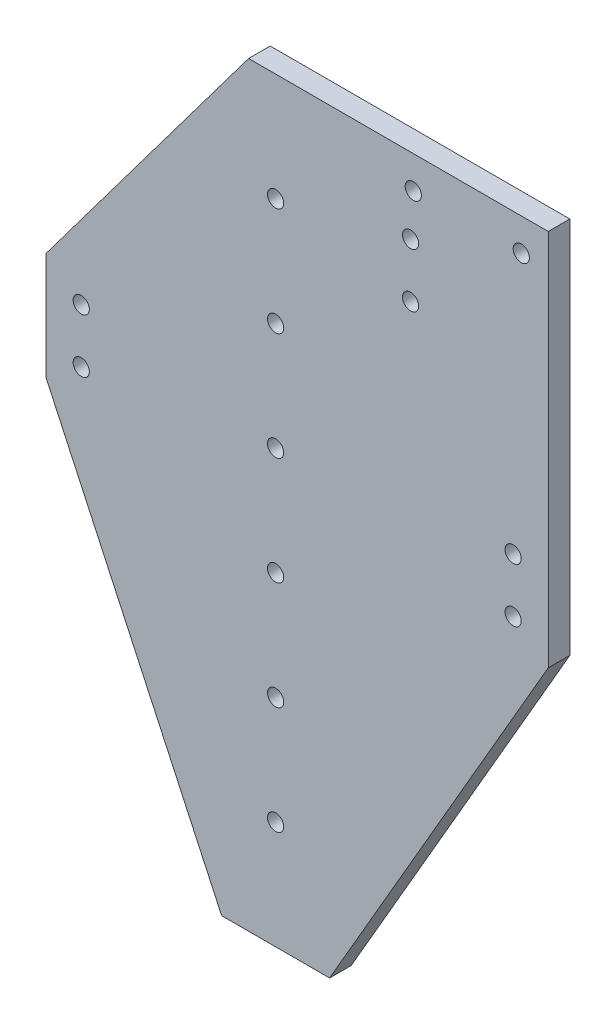
ISO-10303-21;
HEADER;
FILE_DESCRIPTION(('STEP AP214'),'2;1');
FILE_NAME('part.step','',(''),(''),'','','');
FILE_SCHEMA(('AUTOMOTIVE_DESIGN { 1 0 10303 214 1 1 1 1 }'));
ENDSEC;
DATA;
#1=APPLICATION_CONTEXT('core data for automotive mechanical design processes');
#2=APPLICATION_PROTOCOL_DEFINITION('international standard','automotive_design',2000,#1);
#3=PRODUCT_CONTEXT('',#1,'mechanical');
#4=PRODUCT('Part','Part','',(#3));
#5=PRODUCT_RELATED_PRODUCT_CATEGORY('part','',(#4));
#6=PRODUCT_DEFINITION_FORMATION('','',#4);
#7=PRODUCT_DEFINITION_CONTEXT('part definition',#1,'design');
#8=PRODUCT_DEFINITION('design','',#6,#7);
#9=PRODUCT_DEFINITION_SHAPE('','',#8);
#10=(LENGTH_UNIT() NAMED_UNIT(*) SI_UNIT(.MILLI.,.METRE.));
#11=(NAMED_UNIT(*) PLANE_ANGLE_UNIT() SI_UNIT($,.RADIAN.));
#12=(NAMED_UNIT(*) SI_UNIT($,.STERADIAN.) SOLID_ANGLE_UNIT());
#13=UNCERTAINTY_MEASURE_WITH_UNIT(LENGTH_MEASURE(1.E-05),#10,'distance_accuracy_value','');
#14=(GEOMETRIC_REPRESENTATION_CONTEXT(3) GLOBAL_UNCERTAINTY_ASSIGNED_CONTEXT((#13)) GLOBAL_UNIT_ASSIGNED_CONTEXT((#10,
#11,#12)) REPRESENTATION_CONTEXT('',''));
#15=CARTESIAN_POINT('',(0.,0.,0.));
#16=DIRECTION('',(0.,0.,1.));
#17=DIRECTION('',(1.,0.,0.));
#18=AXIS2_PLACEMENT_3D('',#15,#16,#17);
#19=CARTESIAN_POINT('',(0.,0.,4.));
#20=DIRECTION('',(0.,0.,-1.));
#21=DIRECTION('',(-1.,0.,0.));
#22=AXIS2_PLACEMENT_3D('',#19,#20,#21);
#23=PLANE('',#22);
#24=DIRECTION('',(0.50079253728353,0.865567348391287,0.));
#25=VECTOR('',#24,1.);
#26=CARTESIAN_POINT('',(-40.5,-70.,4.));
#27=LINE('',#26,#25);
#28=CARTESIAN_POINT('',(-40.5,-70.,4.));
#29=VERTEX_POINT('',#28);
#30=CARTESIAN_POINT('',(0.,0.,4.));
#31=VERTEX_POINT('',#30);
#32=EDGE_CURVE('E143',#29,#31,#27,.T.);
#33=ORIENTED_EDGE('',*,*,#32,.T.);
#34=DIRECTION('',(0.,1.,0.));
#35=VECTOR('',#34,1.);
#36=CARTESIAN_POINT('',(0.,0.,4.));
#37=LINE('',#36,#35);
#38=CARTESIAN_POINT('',(0.,70.,4.));
#39=VERTEX_POINT('',#38);
#40=EDGE_CURVE('E96',#31,#39,#37,.T.);
#41=ORIENTED_EDGE('',*,*,#40,.T.);
#42=DIRECTION('',(-1.,0.,0.));
#43=VECTOR('',#42,1.);
#44=CARTESIAN_POINT('',(-55.5,70.,4.));
#45=LINE('',#44,#43);
#46=CARTESIAN_POINT('',(-55.5,70.,4.));
#47=VERTEX_POINT('',#46);
#48=EDGE_CURVE('E159',#39,#47,#45,.T.);
#49=ORIENTED_EDGE('',*,*,#48,.T.);
#50=DIRECTION('',(-0.6,-0.8,0.));
#51=VECTOR('',#50,1.);
#52=CARTESIAN_POINT('',(-93.,20.,4.));
#53=LINE('',#52,#51);
#54=CARTESIAN_POINT('',(-93.,20.,4.));
#55=VERTEX_POINT('',#54);
#56=EDGE_CURVE('E112',#47,#55,#53,.T.);
#57=ORIENTED_EDGE('',*,*,#56,.T.);
#58=DIRECTION('',(0.,-1.,0.));
#59=VECTOR('',#58,1.);
#60=CARTESIAN_POINT('',(-93.,0.,4.));
#61=LINE('',#60,#59);
#62=CARTESIAN_POINT('',(-93.,0.,4.));
#63=VERTEX_POINT('',#62);
#64=EDGE_CURVE('E108',#55,#63,#61,.T.);
#65=ORIENTED_EDGE('',*,*,#64,.T.);
#66=DIRECTION('',(0.421111306454629,-0.907008967748432,0.));
#67=VECTOR('',#66,1.);
#68=CARTESIAN_POINT('',(-93.,0.,4.));
#69=LINE('',#68,#67);
#70=CARTESIAN_POINT('',(-60.5,-70.,4.));
#71=VERTEX_POINT('',#70);
#72=EDGE_CURVE('E115',#63,#71,#69,.T.);
#73=ORIENTED_EDGE('',*,*,#72,.T.);
#74=DIRECTION('',(1.,0.,0.));
#75=VECTOR('',#74,1.);
#76=CARTESIAN_POINT('',(-60.5,-70.,4.));
#77=LINE('',#76,#75);
#78=EDGE_CURVE('E59',#71,#29,#77,.T.);
#79=ORIENTED_EDGE('',*,*,#78,.T.);
#80=EDGE_LOOP('',(#33,#41,#49,#57,#65,#73,#79));
#81=FACE_BOUND('',#80,.T.);
#82=CARTESIAN_POINT('',(-86.5,15.,4.));
#83=DIRECTION('',(0.,0.,1.));
#84=DIRECTION('',(1.,0.,0.));
#85=AXIS2_PLACEMENT_3D('',#82,#83,#84);
#86=CIRCLE('',#85,1.5);
#87=CARTESIAN_POINT('',(-85.,15.,4.));
#88=VERTEX_POINT('',#87);
#89=EDGE_CURVE('E137',#88,#88,#86,.T.);
#90=ORIENTED_EDGE('',*,*,#89,.F.);
#91=EDGE_LOOP('',(#90));
#92=FACE_BOUND('',#91,.T.);
#93=CARTESIAN_POINT('',(-86.5,5.00000000000003,4.));
#94=DIRECTION('',(0.,0.,1.));
#95=DIRECTION('',(-1.,0.,0.));
#96=AXIS2_PLACEMENT_3D('',#93,#94,#95);
#97=CIRCLE('',#96,1.5);
#98=CARTESIAN_POINT('',(-88.,5.00000000000003,4.));
#99=VERTEX_POINT('',#98);
#100=EDGE_CURVE('E175',#99,#99,#97,.T.);
#101=ORIENTED_EDGE('',*,*,#100,.F.);
#102=EDGE_LOOP('',(#101));
#103=FACE_BOUND('',#102,.T.);
#104=CARTESIAN_POINT('',(-6.50000000000001,5.00000000000003,4.));
#105=DIRECTION('',(0.,0.,1.));
#106=DIRECTION('',(1.,0.,0.));
#107=AXIS2_PLACEMENT_3D('',#104,#105,#106);
#108=CIRCLE('',#107,1.5);
#109=CARTESIAN_POINT('',(-5.,5.00000000000003,4.));
#110=VERTEX_POINT('',#109);
#111=EDGE_CURVE('E178',#110,#110,#108,.T.);
#112=ORIENTED_EDGE('',*,*,#111,.F.);
#113=EDGE_LOOP('',(#112));
#114=FACE_BOUND('',#113,.T.);
#115=CARTESIAN_POINT('',(-6.50000000000001,15.,4.));
#116=DIRECTION('',(0.,0.,1.));
#117=DIRECTION('',(-1.,0.,0.));
#118=AXIS2_PLACEMENT_3D('',#115,#116,#117);
#119=CIRCLE('',#118,1.5);
#120=CARTESIAN_POINT('',(-8.00000000000001,15.,4.));
#121=VERTEX_POINT('',#120);
#122=EDGE_CURVE('E183',#121,#121,#119,.T.);
#123=ORIENTED_EDGE('',*,*,#122,.F.);
#124=EDGE_LOOP('',(#123));
#125=FACE_BOUND('',#124,.T.);
#126=CARTESIAN_POINT('',(-25.5,56.,4.));
#127=DIRECTION('',(0.,0.,1.));
#128=DIRECTION('',(1.,0.,0.));
#129=AXIS2_PLACEMENT_3D('',#126,#127,#128);
#130=CIRCLE('',#129,1.5);
#131=CARTESIAN_POINT('',(-24.,56.,4.));
#132=VERTEX_POINT('',#131);
#133=EDGE_CURVE('E188',#132,#132,#130,.T.);
#134=ORIENTED_EDGE('',*,*,#133,.F.);
#135=EDGE_LOOP('',(#134));
#136=FACE_BOUND('',#135,.T.);
#137=CARTESIAN_POINT('',(-25.4999999999999,46.,4.));
#138=DIRECTION('',(0.,0.,1.));
#139=DIRECTION('',(1.,0.,0.));
#140=AXIS2_PLACEMENT_3D('',#137,#138,#139);
#141=CIRCLE('',#140,1.5);
#142=CARTESIAN_POINT('',(-23.9999999999999,46.,4.));
#143=VERTEX_POINT('',#142);
#144=EDGE_CURVE('E196',#143,#143,#141,.T.);
#145=ORIENTED_EDGE('',*,*,#144,.F.);
#146=EDGE_LOOP('',(#145));
#147=FACE_BOUND('',#146,.T.);
#148=CARTESIAN_POINT('',(-50.5,10.,4.));
#149=DIRECTION('',(0.,0.,1.));
#150=DIRECTION('',(1.,0.,0.));
#151=AXIS2_PLACEMENT_3D('',#148,#149,#150);
#152=CIRCLE('',#151,1.5);
#153=CARTESIAN_POINT('',(-49.,10.,4.));
#154=VERTEX_POINT('',#153);
#155=EDGE_CURVE('E204',#154,#154,#152,.T.);
#156=ORIENTED_EDGE('',*,*,#155,.F.);
#157=EDGE_LOOP('',(#156));
#158=FACE_BOUND('',#157,.T.);
#159=CARTESIAN_POINT('',(-50.5000000000001,30.,4.));
#160=DIRECTION('',(0.,0.,1.));
#161=DIRECTION('',(1.,0.,0.));
#162=AXIS2_PLACEMENT_3D('',#159,#160,#161);
#163=CIRCLE('',#162,1.5);
#164=CARTESIAN_POINT('',(-49.0000000000001,30.,4.));
#165=VERTEX_POINT('',#164);
#166=EDGE_CURVE('E206',#165,#165,#163,.T.);
#167=ORIENTED_EDGE('',*,*,#166,.F.);
#168=EDGE_LOOP('',(#167));
#169=FACE_BOUND('',#168,.T.);
#170=CARTESIAN_POINT('',(-50.5000000000001,50.,4.));
#171=DIRECTION('',(0.,0.,1.));
#172=DIRECTION('',(1.,0.,0.));
#173=AXIS2_PLACEMENT_3D('',#170,#171,#172);
#174=CIRCLE('',#173,1.5);
#175=CARTESIAN_POINT('',(-49.0000000000001,50.,4.));
#176=VERTEX_POINT('',#175);
#177=EDGE_CURVE('E211',#176,#176,#174,.T.);
#178=ORIENTED_EDGE('',*,*,#177,.F.);
#179=EDGE_LOOP('',(#178));
#180=FACE_BOUND('',#179,.T.);
#181=CARTESIAN_POINT('',(-50.4999999999998,-10.,4.));
#182=DIRECTION('',(0.,0.,1.));
#183=DIRECTION('',(1.,0.,0.));
#184=AXIS2_PLACEMENT_3D('',#181,#182,#183);
#185=CIRCLE('',#184,1.5);
#186=CARTESIAN_POINT('',(-48.9999999999998,-10.,4.));
#187=VERTEX_POINT('',#186);
#188=EDGE_CURVE('E219',#187,#187,#185,.T.);
#189=ORIENTED_EDGE('',*,*,#188,.F.);
#190=EDGE_LOOP('',(#189));
#191=FACE_BOUND('',#190,.T.);
#192=CARTESIAN_POINT('',(-50.4999999999996,-30.,4.));
#193=DIRECTION('',(0.,0.,1.));
#194=DIRECTION('',(1.,0.,0.));
#195=AXIS2_PLACEMENT_3D('',#192,#193,#194);
#196=CIRCLE('',#195,1.5);
#197=CARTESIAN_POINT('',(-48.9999999999996,-30.,4.));
#198=VERTEX_POINT('',#197);
#199=EDGE_CURVE('E228',#198,#198,#196,.T.);
#200=ORIENTED_EDGE('',*,*,#199,.F.);
#201=EDGE_LOOP('',(#200));
#202=FACE_BOUND('',#201,.T.);
#203=CARTESIAN_POINT('',(-5.,64.,4.));
#204=DIRECTION('',(0.,0.,1.));
#205=DIRECTION('',(1.,0.,0.));
#206=AXIS2_PLACEMENT_3D('',#203,#204,#205);
#207=CIRCLE('',#206,1.5);
#208=CARTESIAN_POINT('',(-3.5,64.,4.));
#209=VERTEX_POINT('',#208);
#210=EDGE_CURVE('E235',#209,#209,#207,.T.);
#211=ORIENTED_EDGE('',*,*,#210,.F.);
#212=EDGE_LOOP('',(#211));
#213=FACE_BOUND('',#212,.T.);
#214=CARTESIAN_POINT('',(-25.,64.,4.));
#215=DIRECTION('',(0.,0.,1.));
#216=DIRECTION('',(1.,0.,0.));
#217=AXIS2_PLACEMENT_3D('',#214,#215,#216);
#218=CIRCLE('',#217,1.5);
#219=CARTESIAN_POINT('',(-23.5,64.,4.));
#220=VERTEX_POINT('',#219);
#221=EDGE_CURVE('E238',#220,#220,#218,.T.);
#222=ORIENTED_EDGE('',*,*,#221,.F.);
#223=EDGE_LOOP('',(#222));
#224=FACE_BOUND('',#223,.T.);
#225=CARTESIAN_POINT('',(-50.4999999999994,-50.,4.));
#226=DIRECTION('',(0.,0.,1.));
#227=DIRECTION('',(1.,0.,0.));
#228=AXIS2_PLACEMENT_3D('',#225,#226,#227);
#229=CIRCLE('',#228,1.5);
#230=CARTESIAN_POINT('',(-48.9999999999994,-50.,4.));
#231=VERTEX_POINT('',#230);
#232=EDGE_CURVE('E242',#231,#231,#229,.T.);
#233=ORIENTED_EDGE('',*,*,#232,.F.);
#234=EDGE_LOOP('',(#233));
#235=FACE_BOUND('',#234,.T.);
#236=ADVANCED_FACE('F41',(#81,#92,#103,#114,#125,#136,#147,#158,#169,#180,#191,#202,#213,#224,
#235),#23,.F.);
#237=CARTESIAN_POINT('',(0.,0.,0.));
#238=DIRECTION('',(0.,0.,-1.));
#239=DIRECTION('',(-1.,0.,0.));
#240=AXIS2_PLACEMENT_3D('',#237,#238,#239);
#241=PLANE('',#240);
#242=CARTESIAN_POINT('',(-25.,64.,0.));
#243=DIRECTION('',(0.,0.,1.));
#244=DIRECTION('',(1.,0.,0.));
#245=AXIS2_PLACEMENT_3D('',#242,#243,#244);
#246=CIRCLE('',#245,1.5);
#247=CARTESIAN_POINT('',(-23.5,64.,0.));
#248=VERTEX_POINT('',#247);
#249=EDGE_CURVE('E241',#248,#248,#246,.T.);
#250=ORIENTED_EDGE('',*,*,#249,.T.);
#251=EDGE_LOOP('',(#250));
#252=FACE_BOUND('',#251,.T.);
#253=CARTESIAN_POINT('',(-50.4999999999996,-30.,0.));
#254=DIRECTION('',(0.,0.,1.));
#255=DIRECTION('',(1.,0.,0.));
#256=AXIS2_PLACEMENT_3D('',#253,#254,#255);
#257=CIRCLE('',#256,1.5);
#258=CARTESIAN_POINT('',(-48.9999999999996,-30.,0.));
#259=VERTEX_POINT('',#258);
#260=EDGE_CURVE('E230',#259,#259,#257,.T.);
#261=ORIENTED_EDGE('',*,*,#260,.T.);
#262=EDGE_LOOP('',(#261));
#263=FACE_BOUND('',#262,.T.);
#264=CARTESIAN_POINT('',(-50.5000000000001,50.,0.));
#265=DIRECTION('',(0.,0.,1.));
#266=DIRECTION('',(1.,0.,0.));
#267=AXIS2_PLACEMENT_3D('',#264,#265,#266);
#268=CIRCLE('',#267,1.5);
#269=CARTESIAN_POINT('',(-49.0000000000001,50.,0.));
#270=VERTEX_POINT('',#269);
#271=EDGE_CURVE('E220',#270,#270,#268,.T.);
#272=ORIENTED_EDGE('',*,*,#271,.T.);
#273=EDGE_LOOP('',(#272));
#274=FACE_BOUND('',#273,.T.);
#275=CARTESIAN_POINT('',(-50.5,10.,0.));
#276=DIRECTION('',(0.,0.,1.));
#277=DIRECTION('',(1.,0.,0.));
#278=AXIS2_PLACEMENT_3D('',#275,#276,#277);
#279=CIRCLE('',#278,1.5);
#280=CARTESIAN_POINT('',(-49.,10.,0.));
#281=VERTEX_POINT('',#280);
#282=EDGE_CURVE('E203',#281,#281,#279,.T.);
#283=ORIENTED_EDGE('',*,*,#282,.T.);
#284=EDGE_LOOP('',(#283));
#285=FACE_BOUND('',#284,.T.);
#286=CARTESIAN_POINT('',(-25.5,56.,0.));
#287=DIRECTION('',(0.,0.,1.));
#288=DIRECTION('',(1.,0.,0.));
#289=AXIS2_PLACEMENT_3D('',#286,#287,#288);
#290=CIRCLE('',#289,1.5);
#291=CARTESIAN_POINT('',(-24.,56.,0.));
#292=VERTEX_POINT('',#291);
#293=EDGE_CURVE('E194',#292,#292,#290,.T.);
#294=ORIENTED_EDGE('',*,*,#293,.T.);
#295=EDGE_LOOP('',(#294));
#296=FACE_BOUND('',#295,.T.);
#297=CARTESIAN_POINT('',(-6.50000000000001,5.00000000000003,0.));
#298=DIRECTION('',(0.,0.,1.));
#299=DIRECTION('',(1.,0.,0.));
#300=AXIS2_PLACEMENT_3D('',#297,#298,#299);
#301=CIRCLE('',#300,1.5);
#302=CARTESIAN_POINT('',(-5.,5.00000000000003,0.));
#303=VERTEX_POINT('',#302);
#304=EDGE_CURVE('E181',#303,#303,#301,.T.);
#305=ORIENTED_EDGE('',*,*,#304,.T.);
#306=EDGE_LOOP('',(#305));
#307=FACE_BOUND('',#306,.T.);
#308=CARTESIAN_POINT('',(-86.5,15.,0.));
#309=DIRECTION('',(0.,0.,1.));
#310=DIRECTION('',(1.,0.,0.));
#311=AXIS2_PLACEMENT_3D('',#308,#309,#310);
#312=CIRCLE('',#311,1.5);
#313=CARTESIAN_POINT('',(-85.,15.,0.));
#314=VERTEX_POINT('',#313);
#315=EDGE_CURVE('E169',#314,#314,#312,.T.);
#316=ORIENTED_EDGE('',*,*,#315,.T.);
#317=EDGE_LOOP('',(#316));
#318=FACE_BOUND('',#317,.T.);
#319=DIRECTION('',(0.50079253728353,0.865567348391287,0.));
#320=VECTOR('',#319,1.);
#321=CARTESIAN_POINT('',(-40.5,-70.,0.));
#322=LINE('',#321,#320);
#323=CARTESIAN_POINT('',(-40.5,-70.,0.));
#324=VERTEX_POINT('',#323);
#325=CARTESIAN_POINT('',(0.,0.,0.));
#326=VERTEX_POINT('',#325);
#327=EDGE_CURVE('E135',#324,#326,#322,.T.);
#328=ORIENTED_EDGE('',*,*,#327,.F.);
#329=DIRECTION('',(1.,0.,0.));
#330=VECTOR('',#329,1.);
#331=CARTESIAN_POINT('',(-60.5,-70.,0.));
#332=LINE('',#331,#330);
#333=CARTESIAN_POINT('',(-60.5,-70.,0.));
#334=VERTEX_POINT('',#333);
#335=EDGE_CURVE('E89',#334,#324,#332,.T.);
#336=ORIENTED_EDGE('',*,*,#335,.F.);
#337=DIRECTION('',(0.421111306454629,-0.907008967748432,0.));
#338=VECTOR('',#337,1.);
#339=CARTESIAN_POINT('',(-93.,0.,0.));
#340=LINE('',#339,#338);
#341=CARTESIAN_POINT('',(-93.,0.,0.));
#342=VERTEX_POINT('',#341);
#343=EDGE_CURVE('E81',#342,#334,#340,.T.);
#344=ORIENTED_EDGE('',*,*,#343,.F.);
#345=DIRECTION('',(0.,-1.,0.));
#346=VECTOR('',#345,1.);
#347=CARTESIAN_POINT('',(-93.,0.,0.));
#348=LINE('',#347,#346);
#349=CARTESIAN_POINT('',(-93.,20.,0.));
#350=VERTEX_POINT('',#349);
#351=EDGE_CURVE('E125',#350,#342,#348,.T.);
#352=ORIENTED_EDGE('',*,*,#351,.F.);
#353=DIRECTION('',(-0.6,-0.8,0.));
#354=VECTOR('',#353,1.);
#355=CARTESIAN_POINT('',(-93.,20.,0.));
#356=LINE('',#355,#354);
#357=CARTESIAN_POINT('',(-55.5,70.,0.));
#358=VERTEX_POINT('',#357);
#359=EDGE_CURVE('E138',#358,#350,#356,.T.);
#360=ORIENTED_EDGE('',*,*,#359,.F.);
#361=DIRECTION('',(-1.,0.,0.));
#362=VECTOR('',#361,1.);
#363=CARTESIAN_POINT('',(-55.5,70.,0.));
#364=LINE('',#363,#362);
#365=CARTESIAN_POINT('',(0.,70.,0.));
#366=VERTEX_POINT('',#365);
#367=EDGE_CURVE('E140',#366,#358,#364,.T.);
#368=ORIENTED_EDGE('',*,*,#367,.F.);
#369=DIRECTION('',(0.,1.,0.));
#370=VECTOR('',#369,1.);
#371=CARTESIAN_POINT('',(0.,0.,0.));
#372=LINE('',#371,#370);
#373=EDGE_CURVE('E134',#326,#366,#372,.T.);
#374=ORIENTED_EDGE('',*,*,#373,.F.);
#375=EDGE_LOOP('',(#328,#336,#344,#352,#360,#368,#374));
#376=FACE_BOUND('',#375,.T.);
#377=CARTESIAN_POINT('',(-86.5,5.00000000000003,0.));
#378=DIRECTION('',(0.,0.,1.));
#379=DIRECTION('',(-1.,0.,0.));
#380=AXIS2_PLACEMENT_3D('',#377,#378,#379);
#381=CIRCLE('',#380,1.5);
#382=CARTESIAN_POINT('',(-88.,5.00000000000003,0.));
#383=VERTEX_POINT('',#382);
#384=EDGE_CURVE('E174',#383,#383,#381,.T.);
#385=ORIENTED_EDGE('',*,*,#384,.T.);
#386=EDGE_LOOP('',(#385));
#387=FACE_BOUND('',#386,.T.);
#388=CARTESIAN_POINT('',(-6.50000000000001,15.,0.));
#389=DIRECTION('',(0.,0.,1.));
#390=DIRECTION('',(-1.,0.,0.));
#391=AXIS2_PLACEMENT_3D('',#388,#389,#390);
#392=CIRCLE('',#391,1.5);
#393=CARTESIAN_POINT('',(-8.00000000000001,15.,0.));
#394=VERTEX_POINT('',#393);
#395=EDGE_CURVE('E190',#394,#394,#392,.T.);
#396=ORIENTED_EDGE('',*,*,#395,.T.);
#397=EDGE_LOOP('',(#396));
#398=FACE_BOUND('',#397,.T.);
#399=CARTESIAN_POINT('',(-25.4999999999999,46.,0.));
#400=DIRECTION('',(0.,0.,1.));
#401=DIRECTION('',(1.,0.,0.));
#402=AXIS2_PLACEMENT_3D('',#399,#400,#401);
#403=CIRCLE('',#402,1.5);
#404=CARTESIAN_POINT('',(-23.9999999999999,46.,0.));
#405=VERTEX_POINT('',#404);
#406=EDGE_CURVE('E197',#405,#405,#403,.T.);
#407=ORIENTED_EDGE('',*,*,#406,.T.);
#408=EDGE_LOOP('',(#407));
#409=FACE_BOUND('',#408,.T.);
#410=CARTESIAN_POINT('',(-50.5000000000001,30.,0.));
#411=DIRECTION('',(0.,0.,1.));
#412=DIRECTION('',(1.,0.,0.));
#413=AXIS2_PLACEMENT_3D('',#410,#411,#412);
#414=CIRCLE('',#413,1.5);
#415=CARTESIAN_POINT('',(-49.0000000000001,30.,0.));
#416=VERTEX_POINT('',#415);
#417=EDGE_CURVE('E212',#416,#416,#414,.T.);
#418=ORIENTED_EDGE('',*,*,#417,.T.);
#419=EDGE_LOOP('',(#418));
#420=FACE_BOUND('',#419,.T.);
#421=CARTESIAN_POINT('',(-50.4999999999998,-10.,0.));
#422=DIRECTION('',(0.,0.,1.));
#423=DIRECTION('',(1.,0.,0.));
#424=AXIS2_PLACEMENT_3D('',#421,#422,#423);
#425=CIRCLE('',#424,1.5);
#426=CARTESIAN_POINT('',(-48.9999999999998,-10.,0.));
#427=VERTEX_POINT('',#426);
#428=EDGE_CURVE('E225',#427,#427,#425,.T.);
#429=ORIENTED_EDGE('',*,*,#428,.T.);
#430=EDGE_LOOP('',(#429));
#431=FACE_BOUND('',#430,.T.);
#432=CARTESIAN_POINT('',(-5.,64.,0.));
#433=DIRECTION('',(0.,0.,1.));
#434=DIRECTION('',(1.,0.,0.));
#435=AXIS2_PLACEMENT_3D('',#432,#433,#434);
#436=CIRCLE('',#435,1.5);
#437=CARTESIAN_POINT('',(-3.5,64.,0.));
#438=VERTEX_POINT('',#437);
#439=EDGE_CURVE('E232',#438,#438,#436,.T.);
#440=ORIENTED_EDGE('',*,*,#439,.T.);
#441=EDGE_LOOP('',(#440));
#442=FACE_BOUND('',#441,.T.);
#443=CARTESIAN_POINT('',(-50.4999999999994,-50.,0.));
#444=DIRECTION('',(0.,0.,1.));
#445=DIRECTION('',(1.,0.,0.));
#446=AXIS2_PLACEMENT_3D('',#443,#444,#445);
#447=CIRCLE('',#446,1.5);
#448=CARTESIAN_POINT('',(-48.9999999999994,-50.,0.));
#449=VERTEX_POINT('',#448);
#450=EDGE_CURVE('E250',#449,#449,#447,.T.);
#451=ORIENTED_EDGE('',*,*,#450,.T.);
#452=EDGE_LOOP('',(#451));
#453=FACE_BOUND('',#452,.T.);
#454=ADVANCED_FACE('F163',(#252,#263,#274,#285,#296,#307,#318,#376,#387,#398,#409,#420,#431,
#442,#453),#241,.T.);
#455=CARTESIAN_POINT('',(-40.5,-70.,4.));
#456=DIRECTION('',(-0.865567348391287,0.50079253728353,0.));
#457=DIRECTION('',(-0.50079253728353,-0.865567348391287,0.));
#458=AXIS2_PLACEMENT_3D('',#455,#456,#457);
#459=PLANE('',#458);
#460=ORIENTED_EDGE('',*,*,#327,.T.);
#461=DIRECTION('',(0.,0.,-1.));
#462=VECTOR('',#461,1.);
#463=CARTESIAN_POINT('',(0.,0.,4.));
#464=LINE('',#463,#462);
#465=EDGE_CURVE('E11',#31,#326,#464,.T.);
#466=ORIENTED_EDGE('',*,*,#465,.F.);
#467=ORIENTED_EDGE('',*,*,#32,.F.);
#468=DIRECTION('',(0.,0.,-1.));
#469=VECTOR('',#468,1.);
#470=CARTESIAN_POINT('',(-40.5,-70.,4.));
#471=LINE('',#470,#469);
#472=EDGE_CURVE('E129',#29,#324,#471,.T.);
#473=ORIENTED_EDGE('',*,*,#472,.T.);
#474=EDGE_LOOP('',(#460,#466,#467,#473));
#475=FACE_BOUND('',#474,.T.);
#476=ADVANCED_FACE('F43',(#475),#459,.F.);
#477=CARTESIAN_POINT('',(0.,0.,4.));
#478=DIRECTION('',(-1.,0.,0.));
#479=DIRECTION('',(0.,0.,1.));
#480=AXIS2_PLACEMENT_3D('',#477,#478,#479);
#481=PLANE('',#480);
#482=ORIENTED_EDGE('',*,*,#373,.T.);
#483=DIRECTION('',(0.,0.,-1.));
#484=VECTOR('',#483,1.);
#485=CARTESIAN_POINT('',(0.,70.,4.));
#486=LINE('',#485,#484);
#487=EDGE_CURVE('E49',#39,#366,#486,.T.);
#488=ORIENTED_EDGE('',*,*,#487,.F.);
#489=ORIENTED_EDGE('',*,*,#40,.F.);
#490=ORIENTED_EDGE('',*,*,#465,.T.);
#491=EDGE_LOOP('',(#482,#488,#489,#490));
#492=FACE_BOUND('',#491,.T.);
#493=ADVANCED_FACE('F280',(#492),#481,.F.);
#494=CARTESIAN_POINT('',(-55.5,70.,4.));
#495=DIRECTION('',(0.,-1.,0.));
#496=DIRECTION('',(0.,0.,-1.));
#497=AXIS2_PLACEMENT_3D('',#494,#495,#496);
#498=PLANE('',#497);
#499=ORIENTED_EDGE('',*,*,#367,.T.);
#500=DIRECTION('',(0.,0.,-1.));
#501=VECTOR('',#500,1.);
#502=CARTESIAN_POINT('',(-55.5,70.,4.));
#503=LINE('',#502,#501);
#504=EDGE_CURVE('E146',#47,#358,#503,.T.);
#505=ORIENTED_EDGE('',*,*,#504,.F.);
#506=ORIENTED_EDGE('',*,*,#48,.F.);
#507=ORIENTED_EDGE('',*,*,#487,.T.);
#508=EDGE_LOOP('',(#499,#505,#506,#507));
#509=FACE_BOUND('',#508,.T.);
#510=ADVANCED_FACE('F154',(#509),#498,.F.);
#511=CARTESIAN_POINT('',(-93.,20.,4.));
#512=DIRECTION('',(0.8,-0.6,0.));
#513=DIRECTION('',(0.6,0.8,0.));
#514=AXIS2_PLACEMENT_3D('',#511,#512,#513);
#515=PLANE('',#514);
#516=ORIENTED_EDGE('',*,*,#359,.T.);
#517=DIRECTION('',(0.,0.,-1.));
#518=VECTOR('',#517,1.);
#519=CARTESIAN_POINT('',(-93.,20.,4.));
#520=LINE('',#519,#518);
#521=EDGE_CURVE('E124',#55,#350,#520,.T.);
#522=ORIENTED_EDGE('',*,*,#521,.F.);
#523=ORIENTED_EDGE('',*,*,#56,.F.);
#524=ORIENTED_EDGE('',*,*,#504,.T.);
#525=EDGE_LOOP('',(#516,#522,#523,#524));
#526=FACE_BOUND('',#525,.T.);
#527=ADVANCED_FACE('F165',(#526),#515,.F.);
#528=CARTESIAN_POINT('',(-93.,0.,4.));
#529=DIRECTION('',(1.,0.,0.));
#530=DIRECTION('',(0.,0.,-1.));
#531=AXIS2_PLACEMENT_3D('',#528,#529,#530);
#532=PLANE('',#531);
#533=ORIENTED_EDGE('',*,*,#351,.T.);
#534=DIRECTION('',(0.,0.,-1.));
#535=VECTOR('',#534,1.);
#536=CARTESIAN_POINT('',(-93.,0.,4.));
#537=LINE('',#536,#535);
#538=EDGE_CURVE('E118',#63,#342,#537,.T.);
#539=ORIENTED_EDGE('',*,*,#538,.F.);
#540=ORIENTED_EDGE('',*,*,#64,.F.);
#541=ORIENTED_EDGE('',*,*,#521,.T.);
#542=EDGE_LOOP('',(#533,#539,#540,#541));
#543=FACE_BOUND('',#542,.T.);
#544=ADVANCED_FACE('F119',(#543),#532,.F.);
#545=CARTESIAN_POINT('',(-93.,0.,4.));
#546=DIRECTION('',(0.907008967748432,0.421111306454629,0.));
#547=DIRECTION('',(-0.421111306454629,0.907008967748432,0.));
#548=AXIS2_PLACEMENT_3D('',#545,#546,#547);
#549=PLANE('',#548);
#550=ORIENTED_EDGE('',*,*,#343,.T.);
#551=DIRECTION('',(0.,0.,-1.));
#552=VECTOR('',#551,1.);
#553=CARTESIAN_POINT('',(-60.5,-70.,4.));
#554=LINE('',#553,#552);
#555=EDGE_CURVE('E121',#71,#334,#554,.T.);
#556=ORIENTED_EDGE('',*,*,#555,.F.);
#557=ORIENTED_EDGE('',*,*,#72,.F.);
#558=ORIENTED_EDGE('',*,*,#538,.T.);
#559=EDGE_LOOP('',(#550,#556,#557,#558));
#560=FACE_BOUND('',#559,.T.);
#561=ADVANCED_FACE('F127',(#560),#549,.F.);
#562=CARTESIAN_POINT('',(-60.5,-70.,4.));
#563=DIRECTION('',(0.,1.,0.));
#564=DIRECTION('',(0.,0.,1.));
#565=AXIS2_PLACEMENT_3D('',#562,#563,#564);
#566=PLANE('',#565);
#567=ORIENTED_EDGE('',*,*,#335,.T.);
#568=ORIENTED_EDGE('',*,*,#472,.F.);
#569=ORIENTED_EDGE('',*,*,#78,.F.);
#570=ORIENTED_EDGE('',*,*,#555,.T.);
#571=EDGE_LOOP('',(#567,#568,#569,#570));
#572=FACE_BOUND('',#571,.T.);
#573=ADVANCED_FACE('F269',(#572),#566,.F.);
#574=CARTESIAN_POINT('',(-86.5,15.,4.));
#575=DIRECTION('',(0.,0.,-1.));
#576=DIRECTION('',(-1.,0.,0.));
#577=AXIS2_PLACEMENT_3D('',#574,#575,#576);
#578=CYLINDRICAL_SURFACE('',#577,1.5);
#579=ORIENTED_EDGE('',*,*,#89,.T.);
#580=EDGE_LOOP('',(#579));
#581=FACE_BOUND('',#580,.T.);
#582=ORIENTED_EDGE('',*,*,#315,.F.);
#583=EDGE_LOOP('',(#582));
#584=FACE_BOUND('',#583,.T.);
#585=ADVANCED_FACE('F262',(#581,#584),#578,.F.);
#586=CARTESIAN_POINT('',(-86.5,5.00000000000003,4.));
#587=DIRECTION('',(0.,0.,-1.));
#588=DIRECTION('',(-1.,0.,0.));
#589=AXIS2_PLACEMENT_3D('',#586,#587,#588);
#590=CYLINDRICAL_SURFACE('',#589,1.5);
#591=ORIENTED_EDGE('',*,*,#100,.T.);
#592=EDGE_LOOP('',(#591));
#593=FACE_BOUND('',#592,.T.);
#594=ORIENTED_EDGE('',*,*,#384,.F.);
#595=EDGE_LOOP('',(#594));
#596=FACE_BOUND('',#595,.T.);
#597=ADVANCED_FACE('F333',(#593,#596),#590,.F.);
#598=CARTESIAN_POINT('',(-6.50000000000001,5.00000000000003,4.));
#599=DIRECTION('',(0.,0.,-1.));
#600=DIRECTION('',(-1.,0.,0.));
#601=AXIS2_PLACEMENT_3D('',#598,#599,#600);
#602=CYLINDRICAL_SURFACE('',#601,1.5);
#603=ORIENTED_EDGE('',*,*,#111,.T.);
#604=EDGE_LOOP('',(#603));
#605=FACE_BOUND('',#604,.T.);
#606=ORIENTED_EDGE('',*,*,#304,.F.);
#607=EDGE_LOOP('',(#606));
#608=FACE_BOUND('',#607,.T.);
#609=ADVANCED_FACE('F344',(#605,#608),#602,.F.);
#610=CARTESIAN_POINT('',(-6.50000000000001,15.,4.));
#611=DIRECTION('',(0.,0.,-1.));
#612=DIRECTION('',(-1.,0.,0.));
#613=AXIS2_PLACEMENT_3D('',#610,#611,#612);
#614=CYLINDRICAL_SURFACE('',#613,1.5);
#615=ORIENTED_EDGE('',*,*,#122,.T.);
#616=EDGE_LOOP('',(#615));
#617=FACE_BOUND('',#616,.T.);
#618=ORIENTED_EDGE('',*,*,#395,.F.);
#619=EDGE_LOOP('',(#618));
#620=FACE_BOUND('',#619,.T.);
#621=ADVANCED_FACE('F352',(#617,#620),#614,.F.);
#622=CARTESIAN_POINT('',(-25.5,56.,4.));
#623=DIRECTION('',(0.,0.,-1.));
#624=DIRECTION('',(-1.,0.,0.));
#625=AXIS2_PLACEMENT_3D('',#622,#623,#624);
#626=CYLINDRICAL_SURFACE('',#625,1.5);
#627=ORIENTED_EDGE('',*,*,#133,.T.);
#628=EDGE_LOOP('',(#627));
#629=FACE_BOUND('',#628,.T.);
#630=ORIENTED_EDGE('',*,*,#293,.F.);
#631=EDGE_LOOP('',(#630));
#632=FACE_BOUND('',#631,.T.);
#633=ADVANCED_FACE('F359',(#629,#632),#626,.F.);
#634=CARTESIAN_POINT('',(-25.4999999999999,46.,4.));
#635=DIRECTION('',(0.,0.,-1.));
#636=DIRECTION('',(-1.,0.,0.));
#637=AXIS2_PLACEMENT_3D('',#634,#635,#636);
#638=CYLINDRICAL_SURFACE('',#637,1.5);
#639=ORIENTED_EDGE('',*,*,#144,.T.);
#640=EDGE_LOOP('',(#639));
#641=FACE_BOUND('',#640,.T.);
#642=ORIENTED_EDGE('',*,*,#406,.F.);
#643=EDGE_LOOP('',(#642));
#644=FACE_BOUND('',#643,.T.);
#645=ADVANCED_FACE('F367',(#641,#644),#638,.F.);
#646=CARTESIAN_POINT('',(-50.5,10.,4.));
#647=DIRECTION('',(0.,0.,-1.));
#648=DIRECTION('',(-1.,0.,0.));
#649=AXIS2_PLACEMENT_3D('',#646,#647,#648);
#650=CYLINDRICAL_SURFACE('',#649,1.5);
#651=ORIENTED_EDGE('',*,*,#155,.T.);
#652=EDGE_LOOP('',(#651));
#653=FACE_BOUND('',#652,.T.);
#654=ORIENTED_EDGE('',*,*,#282,.F.);
#655=EDGE_LOOP('',(#654));
#656=FACE_BOUND('',#655,.T.);
#657=ADVANCED_FACE('F377',(#653,#656),#650,.F.);
#658=CARTESIAN_POINT('',(-50.5000000000001,30.,4.));
#659=DIRECTION('',(0.,0.,-1.));
#660=DIRECTION('',(-1.,0.,0.));
#661=AXIS2_PLACEMENT_3D('',#658,#659,#660);
#662=CYLINDRICAL_SURFACE('',#661,1.5);
#663=ORIENTED_EDGE('',*,*,#166,.T.);
#664=EDGE_LOOP('',(#663));
#665=FACE_BOUND('',#664,.T.);
#666=ORIENTED_EDGE('',*,*,#417,.F.);
#667=EDGE_LOOP('',(#666));
#668=FACE_BOUND('',#667,.T.);
#669=ADVANCED_FACE('F390',(#665,#668),#662,.F.);
#670=CARTESIAN_POINT('',(-50.5000000000001,50.,4.));
#671=DIRECTION('',(0.,0.,-1.));
#672=DIRECTION('',(-1.,0.,0.));
#673=AXIS2_PLACEMENT_3D('',#670,#671,#672);
#674=CYLINDRICAL_SURFACE('',#673,1.5);
#675=ORIENTED_EDGE('',*,*,#177,.T.);
#676=EDGE_LOOP('',(#675));
#677=FACE_BOUND('',#676,.T.);
#678=ORIENTED_EDGE('',*,*,#271,.F.);
#679=EDGE_LOOP('',(#678));
#680=FACE_BOUND('',#679,.T.);
#681=ADVANCED_FACE('F397',(#677,#680),#674,.F.);
#682=CARTESIAN_POINT('',(-50.4999999999998,-10.,4.));
#683=DIRECTION('',(0.,0.,-1.));
#684=DIRECTION('',(-1.,0.,0.));
#685=AXIS2_PLACEMENT_3D('',#682,#683,#684);
#686=CYLINDRICAL_SURFACE('',#685,1.5);
#687=ORIENTED_EDGE('',*,*,#188,.T.);
#688=EDGE_LOOP('',(#687));
#689=FACE_BOUND('',#688,.T.);
#690=ORIENTED_EDGE('',*,*,#428,.F.);
#691=EDGE_LOOP('',(#690));
#692=FACE_BOUND('',#691,.T.);
#693=ADVANCED_FACE('F403',(#689,#692),#686,.F.);
#694=CARTESIAN_POINT('',(-50.4999999999996,-30.,4.));
#695=DIRECTION('',(0.,0.,-1.));
#696=DIRECTION('',(-1.,0.,0.));
#697=AXIS2_PLACEMENT_3D('',#694,#695,#696);
#698=CYLINDRICAL_SURFACE('',#697,1.5);
#699=ORIENTED_EDGE('',*,*,#199,.T.);
#700=EDGE_LOOP('',(#699));
#701=FACE_BOUND('',#700,.T.);
#702=ORIENTED_EDGE('',*,*,#260,.F.);
#703=EDGE_LOOP('',(#702));
#704=FACE_BOUND('',#703,.T.);
#705=ADVANCED_FACE('F412',(#701,#704),#698,.F.);
#706=CARTESIAN_POINT('',(-5.,64.,4.));
#707=DIRECTION('',(0.,0.,-1.));
#708=DIRECTION('',(-1.,0.,0.));
#709=AXIS2_PLACEMENT_3D('',#706,#707,#708);
#710=CYLINDRICAL_SURFACE('',#709,1.5);
#711=ORIENTED_EDGE('',*,*,#210,.T.);
#712=EDGE_LOOP('',(#711));
#713=FACE_BOUND('',#712,.T.);
#714=ORIENTED_EDGE('',*,*,#439,.F.);
#715=EDGE_LOOP('',(#714));
#716=FACE_BOUND('',#715,.T.);
#717=ADVANCED_FACE('F421',(#713,#716),#710,.F.);
#718=CARTESIAN_POINT('',(-25.,64.,4.));
#719=DIRECTION('',(0.,0.,-1.));
#720=DIRECTION('',(-1.,0.,0.));
#721=AXIS2_PLACEMENT_3D('',#718,#719,#720);
#722=CYLINDRICAL_SURFACE('',#721,1.5);
#723=ORIENTED_EDGE('',*,*,#221,.T.);
#724=EDGE_LOOP('',(#723));
#725=FACE_BOUND('',#724,.T.);
#726=ORIENTED_EDGE('',*,*,#249,.F.);
#727=EDGE_LOOP('',(#726));
#728=FACE_BOUND('',#727,.T.);
#729=ADVANCED_FACE('F435',(#725,#728),#722,.F.);
#730=CARTESIAN_POINT('',(-50.4999999999994,-50.,4.));
#731=DIRECTION('',(0.,0.,-1.));
#732=DIRECTION('',(-1.,0.,0.));
#733=AXIS2_PLACEMENT_3D('',#730,#731,#732);
#734=CYLINDRICAL_SURFACE('',#733,1.5);
#735=ORIENTED_EDGE('',*,*,#232,.T.);
#736=EDGE_LOOP('',(#735));
#737=FACE_BOUND('',#736,.T.);
#738=ORIENTED_EDGE('',*,*,#450,.F.);
#739=EDGE_LOOP('',(#738));
#740=FACE_BOUND('',#739,.T.);
#741=ADVANCED_FACE('F254',(#737,#740),#734,.F.);
#742=CLOSED_SHELL('',(#236,#454,#476,#493,#510,#527,#544,#561,#573,#585,#597,#609,#621,#633,
#645,#657,#669,#681,#693,#705,#717,#729,#741));
#743=MANIFOLD_SOLID_BREP('B2',#742);
#744=ADVANCED_BREP_SHAPE_REPRESENTATION('',(#18,#743),#14);
#745=SHAPE_DEFINITION_REPRESENTATION(#9,#744);
ENDSEC;
END-ISO-10303-21;
